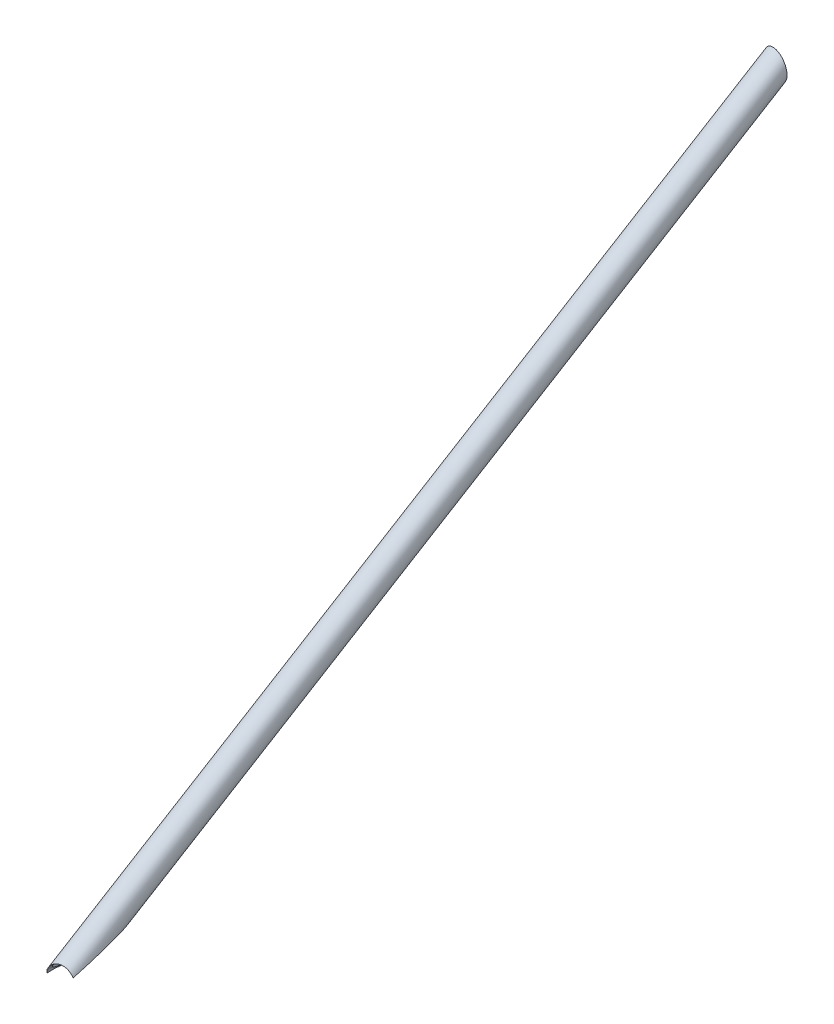
ISO-10303-21;
HEADER;
FILE_DESCRIPTION(('STEP AP214'),'2;1');
FILE_NAME('part.step','',(''),(''),'','','');
FILE_SCHEMA(('AUTOMOTIVE_DESIGN { 1 0 10303 214 1 1 1 1 }'));
ENDSEC;
DATA;
#1=APPLICATION_CONTEXT('core data for automotive mechanical design processes');
#2=APPLICATION_PROTOCOL_DEFINITION('international standard','automotive_design',2000,#1);
#3=PRODUCT_CONTEXT('',#1,'mechanical');
#4=PRODUCT('Part','Part','',(#3));
#5=PRODUCT_RELATED_PRODUCT_CATEGORY('part','',(#4));
#6=PRODUCT_DEFINITION_FORMATION('','',#4);
#7=PRODUCT_DEFINITION_CONTEXT('part definition',#1,'design');
#8=PRODUCT_DEFINITION('design','',#6,#7);
#9=PRODUCT_DEFINITION_SHAPE('','',#8);
#10=(LENGTH_UNIT() NAMED_UNIT(*) SI_UNIT(.MILLI.,.METRE.));
#11=(NAMED_UNIT(*) PLANE_ANGLE_UNIT() SI_UNIT($,.RADIAN.));
#12=(NAMED_UNIT(*) SI_UNIT($,.STERADIAN.) SOLID_ANGLE_UNIT());
#13=UNCERTAINTY_MEASURE_WITH_UNIT(LENGTH_MEASURE(1.E-05),#10,'distance_accuracy_value','');
#14=(GEOMETRIC_REPRESENTATION_CONTEXT(3) GLOBAL_UNCERTAINTY_ASSIGNED_CONTEXT((#13)) GLOBAL_UNIT_ASSIGNED_CONTEXT((#10,
#11,#12)) REPRESENTATION_CONTEXT('',''));
#15=CARTESIAN_POINT('',(0.,0.,0.));
#16=DIRECTION('',(0.,0.,1.));
#17=DIRECTION('',(1.,0.,0.));
#18=AXIS2_PLACEMENT_3D('',#15,#16,#17);
#19=CARTESIAN_POINT('',(150.,500.,-1140.));
#20=DIRECTION('',(0.0991899501072693,-0.396759800429077,0.912547540986877));
#21=DIRECTION('',(0.,-0.917070056253235,-0.39872611141445));
#22=AXIS2_PLACEMENT_3D('',#19,#20,#21);
#23=CYLINDRICAL_SURFACE('',#22,9.79999999999998);
#24=CARTESIAN_POINT('',(150.,500.,-1140.));
#25=DIRECTION('',(0.136924020573454,0.0230393226257371,-0.990313587810925));
#26=DIRECTION('',(0.508281006832032,-0.859722512143854,0.0502754433782237));
#27=AXIS2_PLACEMENT_3D('',#24,#25,#26);
#28=ELLIPSE('',#27,10.89775457985,9.79999999999998);
#29=CARTESIAN_POINT('',(155.539121670054,490.630955055884,-1139.45211055667));
#30=VERTEX_POINT('',#29);
#31=EDGE_CURVE('E112',#30,#30,#28,.T.);
#32=ORIENTED_EDGE('',*,*,#31,.T.);
#33=EDGE_LOOP('',(#32));
#34=FACE_BOUND('',#33,.T.);
#35=CARTESIAN_POINT('',(220.0037526769,210.997702741119,-499.872991264382));
#36=CARTESIAN_POINT('',(220.03556002552,211.045581506711,-499.98311153703));
#37=CARTESIAN_POINT('',(220.067778357118,211.093682206268,-500.093015871501));
#38=CARTESIAN_POINT('',(220.133089382078,211.19035188545,-500.312359740541));
#39=CARTESIAN_POINT('',(220.166182087003,211.238920871262,-500.42179926894));
#40=CARTESIAN_POINT('',(220.266856240907,211.385374312618,-500.749385929453));
#41=CARTESIAN_POINT('',(220.335827671197,211.483996112366,-500.966780081287));
#42=CARTESIAN_POINT('',(220.477978796199,211.683426048303,-501.399186360955));
#43=CARTESIAN_POINT('',(220.551158576042,211.784234228693,-501.614198440496));
#44=CARTESIAN_POINT('',(220.702352368965,211.988303520376,-502.041336513962));
#45=CARTESIAN_POINT('',(220.780366149497,212.091564513524,-502.253462646123));
#46=CARTESIAN_POINT('',(220.934139694492,212.290658259995,-502.653617320866));
#47=CARTESIAN_POINT('',(221.009375246864,212.38623132656,-502.841975705977));
#48=CARTESIAN_POINT('',(221.165198311608,212.579959508328,-503.215117058462));
#49=CARTESIAN_POINT('',(221.245785496772,212.678114465448,-503.399900243539));
#50=CARTESIAN_POINT('',(221.413414006846,212.877530128243,-503.765199044808));
#51=CARTESIAN_POINT('',(221.500463852358,212.978794827011,-503.945708597866));
#52=CARTESIAN_POINT('',(221.682215594535,213.184769626648,-504.30080106719));
#53=CARTESIAN_POINT('',(221.776915527819,213.289478839425,-504.4753854879));
#54=CARTESIAN_POINT('',(221.945291215159,213.470232716847,-504.764230267435));
#55=CARTESIAN_POINT('',(222.016512214622,213.545224200798,-504.880576145729));
#56=CARTESIAN_POINT('',(222.164287824878,213.697386615885,-505.108335477208));
#57=CARTESIAN_POINT('',(222.24084110877,213.774557001996,-505.219750146283));
#58=CARTESIAN_POINT('',(222.4000948405,213.931160247355,-505.435938617257));
#59=CARTESIAN_POINT('',(222.482780364335,214.010587341262,-505.540727461978));
#60=CARTESIAN_POINT('',(222.655621450187,214.172048836842,-505.741709486693));
#61=CARTESIAN_POINT('',(222.745770814519,214.254081041121,-505.837909663119));
#62=CARTESIAN_POINT('',(222.930782107294,214.417146030991,-506.014471692462));
#63=CARTESIAN_POINT('',(223.025249136728,214.498057535257,-506.095351621909));
#64=CARTESIAN_POINT('',(223.223682449658,214.662138601803,-506.242084398049));
#65=CARTESIAN_POINT('',(223.327644569168,214.74530716313,-506.30794378797));
#66=CARTESIAN_POINT('',(223.527799749257,214.898977217815,-506.409354582712));
#67=CARTESIAN_POINT('',(223.62245813081,214.969312188494,-506.448109299148));
#68=CARTESIAN_POINT('',(223.818141272448,215.109137224171,-506.506307129277));
#69=CARTESIAN_POINT('',(223.919155146661,215.178628503094,-506.525782356632));
#70=CARTESIAN_POINT('',(224.126458758042,215.315097256477,-506.541613229992));
#71=CARTESIAN_POINT('',(224.232794466196,215.382038459362,-506.537710974445));
#72=CARTESIAN_POINT('',(224.445436938287,215.509520494145,-506.504837326135));
#73=CARTESIAN_POINT('',(224.551743703341,215.57006162329,-506.475867098207));
#74=CARTESIAN_POINT('',(224.743375831462,215.673694654318,-506.402033121444));
#75=CARTESIAN_POINT('',(224.829338673063,215.718028860184,-506.360450288279));
#76=CARTESIAN_POINT('',(224.996803404158,215.800567145066,-506.264389449461));
#77=CARTESIAN_POINT('',(225.078303733853,215.83876908955,-506.209906969931));
#78=CARTESIAN_POINT('',(225.294354509321,215.935391475288,-506.047195204034));
#79=CARTESIAN_POINT('',(225.423856519224,215.988028537662,-505.928899451726));
#80=CARTESIAN_POINT('',(225.668682010947,216.07954436154,-505.673757286609));
#81=CARTESIAN_POINT('',(225.783952780063,216.118372918788,-505.536845634306));
#82=CARTESIAN_POINT('',(226.032998789649,216.194867481453,-505.211844603524));
#83=CARTESIAN_POINT('',(226.162983993939,216.229196654181,-505.02012298021));
#84=CARTESIAN_POINT('',(226.408157954945,216.285631614921,-504.625574342097));
#85=CARTESIAN_POINT('',(226.523317102834,216.307713225672,-504.422726223909));
#86=CARTESIAN_POINT('',(226.742562772329,216.342842705679,-504.009078695551));
#87=CARTESIAN_POINT('',(226.8465873335,216.355842045154,-503.798242822337));
#88=CARTESIAN_POINT('',(227.045179204777,216.374745353236,-503.372160485957));
#89=CARTESIAN_POINT('',(227.139755299022,216.3806559695,-503.1569183479));
#90=CARTESIAN_POINT('',(227.313744292283,216.386605818291,-502.741236593004));
#91=CARTESIAN_POINT('',(227.393764106944,216.38709249649,-502.541054767823));
#92=CARTESIAN_POINT('',(227.548392329886,216.384150350642,-502.138631973507));
#93=CARTESIAN_POINT('',(227.623000169521,216.380721115776,-501.936390790531));
#94=CARTESIAN_POINT('',(227.839961554268,216.365506941184,-501.327126979252));
#95=CARTESIAN_POINT('',(227.975375407935,216.348794110479,-500.917754216175));
#96=CARTESIAN_POINT('',(228.232286149602,216.305586474585,-500.094309912807));
#97=CARTESIAN_POINT('',(228.353752465368,216.279070698793,-499.680230157442));
#98=CARTESIAN_POINT('',(228.585261616263,216.218397475383,-498.849419653288));
#99=CARTESIAN_POINT('',(228.69530320268,216.184239193732,-498.432688619987));
#100=CARTESIAN_POINT('',(228.906064654326,216.109722643187,-497.596842482021));
#101=CARTESIAN_POINT('',(229.006771639744,216.069356006292,-497.177724905967));
#102=CARTESIAN_POINT('',(229.20013332596,215.983527216208,-496.338141494294));
#103=CARTESIAN_POINT('',(229.292787556765,215.93806476596,-495.917675581462));
#104=CARTESIAN_POINT('',(229.470991088976,215.84291840624,-495.076332225744));
#105=CARTESIAN_POINT('',(229.556549928964,215.793240352003,-494.655456130975));
#106=CARTESIAN_POINT('',(229.721520147706,215.690226524152,-493.812946550329));
#107=CARTESIAN_POINT('',(229.800931412859,215.636890682979,-493.391313050601));
#108=CARTESIAN_POINT('',(230.029148015592,215.473447233457,-492.135414322682));
#109=CARTESIAN_POINT('',(230.169988123022,215.358763686548,-491.300291355377));
#110=CARTESIAN_POINT('',(230.433859337584,215.119982671909,-489.628564397814));
#111=CARTESIAN_POINT('',(230.556889156698,214.995884524313,-488.791960304867));
#112=CARTESIAN_POINT('',(230.787533282199,214.740261756117,-487.117170346715));
#113=CARTESIAN_POINT('',(230.895136854892,214.608732052449,-486.278983787348));
#114=CARTESIAN_POINT('',(231.096380401341,214.339997521533,-484.601880626632));
#115=CARTESIAN_POINT('',(231.190020765879,214.202792853246,-483.762964046377));
#116=CARTESIAN_POINT('',(231.364121387189,213.92444994762,-482.086291425431));
#117=CARTESIAN_POINT('',(231.444609501841,213.783320785225,-481.24853675858));
#118=CARTESIAN_POINT('',(231.593128182638,213.498214932677,-479.572399069136));
#119=CARTESIAN_POINT('',(231.661158582883,213.354238204633,-478.734016038325));
#120=CARTESIAN_POINT('',(231.784747834489,213.064920706468,-477.056858361488));
#121=CARTESIAN_POINT('',(231.840310870345,212.919580411125,-476.218083941829));
#122=CARTESIAN_POINT('',(231.938473261547,212.629130112336,-474.539750933465));
#123=CARTESIAN_POINT('',(231.981072925176,212.484020103495,-473.700192363886));
#124=CARTESIAN_POINT('',(232.048772822799,212.209436208446,-472.097939090977));
#125=CARTESIAN_POINT('',(232.075129038066,212.079759656425,-471.335332491253));
#126=CARTESIAN_POINT('',(232.114487776357,211.824313216532,-469.809006411566));
#127=CARTESIAN_POINT('',(232.12748883077,211.698543759781,-469.045286818457));
#128=CARTESIAN_POINT('',(232.134822170626,211.514988449458,-467.898737451715));
#129=CARTESIAN_POINT('',(232.135237995237,211.454647230271,-467.516353391627));
#130=CARTESIAN_POINT('',(232.131467756979,211.336159327653,-466.75127057713));
#131=CARTESIAN_POINT('',(232.127281774119,211.278012606086,-466.368571828308));
#132=CARTESIAN_POINT('',(232.113631523341,211.164500699147,-465.602910496098));
#133=CARTESIAN_POINT('',(232.104168062251,211.109135090007,-465.219947961974));
#134=CARTESIAN_POINT('',(232.079058013934,211.00190464163,-464.453743304106));
#135=CARTESIAN_POINT('',(232.063411643728,210.950039679596,-464.070501190645));
#136=CARTESIAN_POINT('',(232.022374385927,210.844639670458,-463.256917164985));
#137=CARTESIAN_POINT('',(231.996025811164,210.791676056746,-462.826546895493));
#138=CARTESIAN_POINT('',(231.931687867375,210.692939767071,-461.965757965668));
#139=CARTESIAN_POINT('',(231.89369667788,210.647168217372,-461.535339308297));
#140=CARTESIAN_POINT('',(231.802733822247,210.564975943137,-460.674955057049));
#141=CARTESIAN_POINT('',(231.74975743448,210.52855817276,-460.244989648912));
#142=CARTESIAN_POINT('',(231.655424725332,210.483103335801,-459.601623808325));
#143=CARTESIAN_POINT('',(231.621506691049,210.469481283049,-459.387454034367));
#144=CARTESIAN_POINT('',(231.547896597998,210.445721754516,-458.959922021155));
#145=CARTESIAN_POINT('',(231.508204957544,210.435584026465,-458.746559724545));
#146=CARTESIAN_POINT('',(231.410059633138,210.416962862096,-458.26143107358));
#147=CARTESIAN_POINT('',(231.349464435341,210.409737496682,-457.990039781463));
#148=CARTESIAN_POINT('',(231.21490000988,210.402772913525,-457.450410347947));
#149=CARTESIAN_POINT('',(231.140929490743,210.403034419069,-457.182172513701));
#150=CARTESIAN_POINT('',(230.976976152554,210.412016856456,-456.651379210244));
#151=CARTESIAN_POINT('',(230.887030602703,210.420718304568,-456.388812077079));
#152=CARTESIAN_POINT('',(230.687912451467,210.447257520454,-455.871522364126));
#153=CARTESIAN_POINT('',(230.578747823276,210.465091505353,-455.616796582573));
#154=CARTESIAN_POINT('',(230.368698616877,210.504213203939,-455.181954283669));
#155=CARTESIAN_POINT('',(230.272723862386,210.523481030966,-454.99928621621));
#156=CARTESIAN_POINT('',(230.067397167309,210.566701719194,-454.642118096433));
#157=CARTESIAN_POINT('',(229.958043252596,210.590655272098,-454.467619254767));
#158=CARTESIAN_POINT('',(229.725545542551,210.642382952414,-454.12887002045));
#159=CARTESIAN_POINT('',(229.602414523656,210.670153545399,-453.964610348916));
#160=CARTESIAN_POINT('',(229.342386984366,210.728219889474,-453.64794839698));
#161=CARTESIAN_POINT('',(229.205496140185,210.758514598437,-453.495541272805));
#162=CARTESIAN_POINT('',(228.918221385149,210.820044905617,-453.203464430254));
#163=CARTESIAN_POINT('',(228.767804655659,210.85128266311,-453.063827446327));
#164=CARTESIAN_POINT('',(228.454965582529,210.912738832329,-452.7984791077));
#165=CARTESIAN_POINT('',(228.292542720518,210.94295719996,-452.672768354859));
#166=CARTESIAN_POINT('',(227.957009804585,211.0005123595,-452.435301558305));
#167=CARTESIAN_POINT('',(227.783885786752,211.027845254699,-452.323564348643));
#168=CARTESIAN_POINT('',(227.428821436161,211.077825359224,-452.113937203271));
#169=CARTESIAN_POINT('',(227.246880843222,211.100472430165,-452.016047676549));
#170=CARTESIAN_POINT('',(226.877984681004,211.1393364132,-451.83454429445));
#171=CARTESIAN_POINT('',(226.691110377795,211.155623976197,-451.750779827046));
#172=CARTESIAN_POINT('',(226.311913140475,211.180923774732,-451.595421256622));
#173=CARTESIAN_POINT('',(226.119590352967,211.189936205833,-451.523826826502));
#174=CARTESIAN_POINT('',(225.730902981163,211.1997219212,-451.392000587492));
#175=CARTESIAN_POINT('',(225.534538544611,211.200495506109,-451.331768364066));
#176=CARTESIAN_POINT('',(225.13903222672,211.193062249648,-451.221874987947));
#177=CARTESIAN_POINT('',(224.939890026075,211.184854367311,-451.1722150614));
#178=CARTESIAN_POINT('',(224.504208270185,211.156572783706,-451.074736718853));
#179=CARTESIAN_POINT('',(224.267356389057,211.134637803814,-451.028839715108));
#180=CARTESIAN_POINT('',(223.793228285301,211.076876379378,-450.949700899056));
#181=CARTESIAN_POINT('',(223.555952025395,211.041048648107,-450.916460259531));
#182=CARTESIAN_POINT('',(223.082514044941,210.955118478283,-450.861740074036));
#183=CARTESIAN_POINT('',(222.846352912753,210.905009209785,-450.840266169737));
#184=CARTESIAN_POINT('',(222.376799693227,210.790378999721,-450.808366902896));
#185=CARTESIAN_POINT('',(222.143407698085,210.725857579722,-450.797941907207));
#186=CARTESIAN_POINT('',(221.65805180188,210.575377871167,-450.787023464097));
#187=CARTESIAN_POINT('',(221.40652225065,210.48793429129,-450.787609094262));
#188=CARTESIAN_POINT('',(220.910366166003,210.295995260832,-450.800743483162));
#189=CARTESIAN_POINT('',(220.665740098402,210.191498662804,-450.813293047189));
#190=CARTESIAN_POINT('',(220.18508361354,209.965959023436,-450.849869392075));
#191=CARTESIAN_POINT('',(219.949054382471,209.844913709576,-450.873897750368));
#192=CARTESIAN_POINT('',(219.487251361814,209.587017712996,-450.933077915949));
#193=CARTESIAN_POINT('',(219.261477551474,209.450167062263,-450.968229700726));
#194=CARTESIAN_POINT('',(218.816338965461,209.158066365179,-451.050423044231));
#195=CARTESIAN_POINT('',(218.597264626679,209.002449091401,-451.097733575078));
#196=CARTESIAN_POINT('',(218.17299251229,208.676813301081,-451.203693075977));
#197=CARTESIAN_POINT('',(217.967795099024,208.506794408758,-451.262342341941));
#198=CARTESIAN_POINT('',(217.57263621266,208.15375451181,-451.39104862957));
#199=CARTESIAN_POINT('',(217.382678482238,207.970730333934,-451.4611084408));
#200=CARTESIAN_POINT('',(217.019333011695,207.59340060422,-451.612849546105));
#201=CARTESIAN_POINT('',(216.845944984704,207.399095247785,-451.694530638922));
#202=CARTESIAN_POINT('',(216.517127010207,207.001463426555,-451.869797325056));
#203=CARTESIAN_POINT('',(216.361669145948,206.798151686802,-451.963363922236));
#204=CARTESIAN_POINT('',(216.069353030802,206.384458633962,-452.163150925278));
#205=CARTESIAN_POINT('',(215.932495913643,206.174076890928,-452.269372101704));
#206=CARTESIAN_POINT('',(215.678221609351,205.74897311671,-452.495305197383));
#207=CARTESIAN_POINT('',(215.560797049619,205.534252766422,-452.615011971174));
#208=CARTESIAN_POINT('',(215.345888548902,205.103516898915,-452.869072079184));
#209=CARTESIAN_POINT('',(215.248400293771,204.887501672341,-453.00342223496));
#210=CARTESIAN_POINT('',(215.090890621672,204.500412096529,-453.259901447249));
#211=CARTESIAN_POINT('',(215.027272668419,204.328906974948,-453.379184368226));
#212=CARTESIAN_POINT('',(214.912913340089,203.989638389092,-453.628743474979));
#213=CARTESIAN_POINT('',(214.862170266401,203.821874433904,-453.759018207557));
#214=CARTESIAN_POINT('',(214.773311251004,203.492774995035,-454.031016686563));
#215=CARTESIAN_POINT('',(214.735177699656,203.331430825464,-454.172724119594));
#216=CARTESIAN_POINT('',(214.670838441952,203.017579461572,-454.468164140243));
#217=CARTESIAN_POINT('',(214.644632711819,202.865072249635,-454.621896703889));
#218=CARTESIAN_POINT('',(214.603066061234,202.570604579879,-454.942471335902));
#219=CARTESIAN_POINT('',(214.587778618253,202.428721227632,-455.10939398228));
#220=CARTESIAN_POINT('',(214.567006406174,202.159128267461,-455.454880189148));
#221=CARTESIAN_POINT('',(214.561520903747,202.031417599885,-455.633442877757));
#222=CARTESIAN_POINT('',(214.558726260017,201.792082847687,-456.000963599059));
#223=CARTESIAN_POINT('',(214.561412930517,201.680450553697,-456.189916258206));
#224=CARTESIAN_POINT('',(214.573192065187,201.47414046516,-456.576658516784));
#225=CARTESIAN_POINT('',(214.582285322902,201.379464772746,-456.774449208084));
#226=CARTESIAN_POINT('',(214.607278186622,201.191144694196,-457.214168423304));
#227=CARTESIAN_POINT('',(214.624124428264,201.100917551685,-457.457504175851));
#228=CARTESIAN_POINT('',(214.661965490966,200.942745834265,-457.950964251487));
#229=CARTESIAN_POINT('',(214.682961612019,200.874808259575,-458.201090680592));
#230=CARTESIAN_POINT('',(214.727343631655,200.758561143974,-458.706421705087));
#231=CARTESIAN_POINT('',(214.750736939813,200.710314906425,-458.961639954274));
#232=CARTESIAN_POINT('',(214.798608170743,200.630964957437,-459.474516530104));
#233=CARTESIAN_POINT('',(214.823085953751,200.599859043913,-459.732174538974));
#234=CARTESIAN_POINT('',(214.882939148638,200.541779294508,-460.35994339471));
#235=CARTESIAN_POINT('',(214.918470539493,200.522346075851,-460.73072436466));
#236=CARTESIAN_POINT('',(214.988979598822,200.506271823783,-461.47290915486));
#237=CARTESIAN_POINT('',(215.023956900294,200.509645311717,-461.844313221381));
#238=CARTESIAN_POINT('',(215.093033062411,200.534106985856,-462.587414891319));
#239=CARTESIAN_POINT('',(215.127129742027,200.555235481946,-462.959111238201));
#240=CARTESIAN_POINT('',(215.194318703498,200.611399204075,-463.701415006376));
#241=CARTESIAN_POINT('',(215.227411206734,200.646431340567,-464.072022651172));
#242=CARTESIAN_POINT('',(215.293013269162,200.727899527088,-464.815251961846));
#243=CARTESIAN_POINT('',(215.325515396544,200.774430787414,-465.187863647876));
#244=CARTESIAN_POINT('',(215.389844255407,200.87656829924,-465.931899971359));
#245=CARTESIAN_POINT('',(215.421670958298,200.932174934028,-466.303324558));
#246=CARTESIAN_POINT('',(215.48481743373,201.050738775214,-467.044443355389));
#247=CARTESIAN_POINT('',(215.516137910028,201.113684556248,-467.414139347984));
#248=CARTESIAN_POINT('',(215.578531460335,201.245767947008,-468.152428170174));
#249=CARTESIAN_POINT('',(215.609604540106,201.314905412085,-468.521021025334));
#250=CARTESIAN_POINT('',(215.697247140183,201.517422333069,-469.559996662244));
#251=CARTESIAN_POINT('',(215.753762722179,201.65686189066,-470.229203160508));
#252=CARTESIAN_POINT('',(215.86769069973,201.948994806294,-471.564656359521));
#253=CARTESIAN_POINT('',(215.92510315786,202.101689092557,-472.230902849541));
#254=CARTESIAN_POINT('',(216.041714327821,202.417758169465,-473.560870278523));
#255=CARTESIAN_POINT('',(216.100913482433,202.58113561953,-474.224590544769));
#256=CARTESIAN_POINT('',(216.221843751786,202.916770823289,-475.549551882029));
#257=CARTESIAN_POINT('',(216.283574895249,203.089028677725,-476.210792924826));
#258=CARTESIAN_POINT('',(216.410400729591,203.441649956388,-477.532487840248));
#259=CARTESIAN_POINT('',(216.475503090714,203.62203173095,-478.192936075054));
#260=CARTESIAN_POINT('',(216.609582658873,203.989707201696,-479.511514639894));
#261=CARTESIAN_POINT('',(216.678559890603,204.177000941928,-480.169644955127));
#262=CARTESIAN_POINT('',(216.821013803269,204.557928198977,-481.483416589769));
#263=CARTESIAN_POINT('',(216.894489461128,204.751560269639,-482.139058439372));
#264=CARTESIAN_POINT('',(217.046621618757,205.144892172153,-483.447915261066));
#265=CARTESIAN_POINT('',(217.125278100046,205.34459198236,-484.101130241805));
#266=CARTESIAN_POINT('',(217.287770659712,205.7481134836,-485.399146919923));
#267=CARTESIAN_POINT('',(217.371554119183,205.951882332987,-486.043971611461));
#268=CARTESIAN_POINT('',(217.545732154359,206.365274200028,-487.330854308898));
#269=CARTESIAN_POINT('',(217.636126775996,206.574897258349,-487.972912295543));
#270=CARTESIAN_POINT('',(217.8245187696,207.000264103688,-489.254200815399));
#271=CARTESIAN_POINT('',(217.922519445984,207.216010524864,-489.893429990724));
#272=CARTESIAN_POINT('',(218.12725159035,207.653873075863,-491.168292383483));
#273=CARTESIAN_POINT('',(218.233982889653,207.875989082569,-491.803925670137));
#274=CARTESIAN_POINT('',(218.457341711957,208.326509101169,-493.069186482446));
#275=CARTESIAN_POINT('',(218.573940966813,208.554893964726,-493.698825775585));
#276=CARTESIAN_POINT('',(218.819211486035,209.019323980088,-494.952890239999));
#277=CARTESIAN_POINT('',(218.947882246118,209.255368811632,-495.577315627897));
#278=CARTESIAN_POINT('',(219.219830997629,209.73612539211,-496.819166860318));
#279=CARTESIAN_POINT('',(219.363098972153,209.980831123501,-497.436597185985));
#280=CARTESIAN_POINT('',(219.591889867724,210.355777760452,-498.355996326641));
#281=CARTESIAN_POINT('',(219.67046158271,210.482064382989,-498.661314519848));
#282=CARTESIAN_POINT('',(219.832916103238,210.7375821389,-499.269290082107));
#283=CARTESIAN_POINT('',(219.916798647859,210.866813127419,-499.571947581048));
#284=CARTESIAN_POINT('',(220.0037526769,210.997702741119,-499.872991264382));
#285=B_SPLINE_CURVE_WITH_KNOTS('',3,(#35,#36,#37,#38,#39,#40,#41,#42,#43,#44,#45,#46,#47,#48,
#49,#50,#51,#52,#53,#54,#55,#56,#57,#58,#59,#60,#61,#62,#63,#64,#65,#66,#67,#68,#69,#70,#71,#72,
#73,#74,#75,#76,#77,#78,#79,#80,#81,#82,#83,#84,#85,#86,#87,#88,#89,#90,#91,#92,#93,#94,#95,#96,
#97,#98,#99,#100,#101,#102,#103,#104,#105,#106,#107,#108,#109,#110,#111,#112,#113,#114,#115,
#116,#117,#118,#119,#120,#121,#122,#123,#124,#125,#126,#127,#128,#129,#130,#131,#132,#133,#134,
#135,#136,#137,#138,#139,#140,#141,#142,#143,#144,#145,#146,#147,#148,#149,#150,#151,#152,#153,
#154,#155,#156,#157,#158,#159,#160,#161,#162,#163,#164,#165,#166,#167,#168,#169,#170,#171,#172,
#173,#174,#175,#176,#177,#178,#179,#180,#181,#182,#183,#184,#185,#186,#187,#188,#189,#190,#191,
#192,#193,#194,#195,#196,#197,#198,#199,#200,#201,#202,#203,#204,#205,#206,#207,#208,#209,#210,
#211,#212,#213,#214,#215,#216,#217,#218,#219,#220,#221,#222,#223,#224,#225,#226,#227,#228,#229,
#230,#231,#232,#233,#234,#235,#236,#237,#238,#239,#240,#241,#242,#243,#244,#245,#246,#247,#248,
#249,#250,#251,#252,#253,#254,#255,#256,#257,#258,#259,#260,#261,#262,#263,#264,#265,#266,#267,
#268,#269,#270,#271,#272,#273,#274,#275,#276,#277,#278,#279,#280,#281,#282,#283,#284),
.UNSPECIFIED.,.T.,.F.,(4,2,2,2,2,2,2,2,2,2,2,2,2,2,2,2,2,2,2,2,2,2,2,2,2,2,2,2,2,2,2,2,2,2,2,2,
2,2,2,2,2,2,2,2,2,2,2,2,2,2,2,2,2,2,2,2,2,2,2,2,2,2,2,2,2,2,2,2,2,2,2,2,2,2,2,2,2,2,2,2,2,2,2,2,
2,2,2,2,2,2,2,2,2,2,2,2,2,2,2,2,2,2,2,2,2,2,2,2,2,2,2,2,2,2,2,2,2,2,2,2,2,2,2,2,4),(0.,
0.372656770587724,0.745318471844485,1.49071308268037,2.23612277740791,2.98149664065475,
3.65406094616525,4.32658416780523,5.00001037709808,5.67326429844799,6.14012333885416,
6.60686661692455,7.07250907460701,7.53776868574708,7.98208141688536,8.42620022577558,
8.79727076074999,9.16772216178766,9.54226787200702,9.91679617914032,10.2314548196973,
10.5462227509919,11.0924005303048,11.6405442480981,12.3413804236135,13.0435952029321,
13.7495340451263,14.4548103535961,15.1014276928732,15.7481128752654,17.0420983316937,
18.3388680707734,19.635779396623,20.934454351504,22.233205051697,23.5301804953071,
24.8271799002082,27.3907862639257,29.9545779320781,32.5201449360634,35.0856401251403,
37.6456288357005,40.205651635382,42.7648139098149,45.3239153198481,47.6458265647582,
49.9679931131774,51.1293146701851,52.2906160362071,53.4517399097151,54.6128230314761,
55.9158987685947,57.2191783619642,58.5228690590363,59.1745812907695,59.8262463275146,
60.6603839156199,61.4946020880321,62.3268990279022,63.1588514926516,63.7800162550909,
64.4012727826592,65.0219578790863,65.6423879727893,66.2643663099992,66.8863715171704,
67.5092062511456,68.1320593765177,68.7477813950486,69.3634868618619,69.9791698611069,
70.5949242266922,71.3209183365126,72.0469797030348,72.7733888825721,73.4998221799774,
74.2977894077413,75.0958103504572,75.8939409900742,76.6920700144812,77.5096568835787,
78.3272650924683,79.1450734849104,79.9628677161376,80.7793709675808,81.5959239631073,
82.4121664494201,83.2282321163839,83.8827396896561,84.5371608673725,85.1906642246678,
85.8441662792423,86.5020258338586,87.1598361689056,87.8173094363615,88.4748641553017,
89.2538141784688,90.0330086036064,90.8146886044151,91.5962681563083,92.7142390967945,
93.8329219317383,94.9541514390703,96.0751319357715,97.2057245988692,98.3363650236135,
99.4652682293601,100.594145068715,102.651682945834,104.709365027261,106.767561303538,
108.825780933951,110.888908964135,112.952050144164,115.014723834427,117.077390167357,
119.121607870329,121.165839777025,123.210964816946,125.256050353934,127.295463854278,
129.334792196911,131.372730417662,132.391538960581,133.410297488323),.UNSPECIFIED.);
#286=CARTESIAN_POINT('',(215.417930816631,200.926928641913,-466.260367661848));
#287=VERTEX_POINT('',#286);
#288=CARTESIAN_POINT('',(227.660575393344,211.04511124453,-452.251060542699));
#289=VERTEX_POINT('',#288);
#290=EDGE_CURVE('E114',#287,#289,#285,.T.);
#291=ORIENTED_EDGE('',*,*,#290,.T.);
#292=CARTESIAN_POINT('',(222.839154654503,199.656094830706,-473.787293070432));
#293=CARTESIAN_POINT('',(223.018126877463,199.643591059707,-473.758535960361));
#294=CARTESIAN_POINT('',(223.195574144502,199.631988397977,-473.720070631462));
#295=CARTESIAN_POINT('',(223.545962963295,199.610563433115,-473.625840161621));
#296=CARTESIAN_POINT('',(223.718901219133,199.600742402683,-473.570062730354));
#297=CARTESIAN_POINT('',(224.230485185833,199.573798926252,-473.379723840667));
#298=CARTESIAN_POINT('',(224.560890637959,199.559265174873,-473.222340151423));
#299=CARTESIAN_POINT('',(225.115207150444,199.539218153319,-472.909283521848));
#300=CARTESIAN_POINT('',(225.344842434828,199.532351103039,-472.763341178782));
#301=CARTESIAN_POINT('',(225.790770047889,199.521632874282,-472.451963802108));
#302=CARTESIAN_POINT('',(226.007054070695,199.517783556072,-472.286516817125));
#303=CARTESIAN_POINT('',(226.426972466851,199.51281750651,-471.940149775685));
#304=CARTESIAN_POINT('',(226.630598704961,199.511702515186,-471.759219942233));
#305=CARTESIAN_POINT('',(227.02615371479,199.511980522969,-471.384918854753));
#306=CARTESIAN_POINT('',(227.218078060016,199.513374465123,-471.191542948894));
#307=CARTESIAN_POINT('',(227.587069014274,199.518453233163,-470.799016805833));
#308=CARTESIAN_POINT('',(227.764367576869,199.522087720744,-470.60008274809));
#309=CARTESIAN_POINT('',(228.109441288441,199.531502625706,-470.194244537608));
#310=CARTESIAN_POINT('',(228.277217713129,199.537282754845,-469.987341458768));
#311=CARTESIAN_POINT('',(228.60418007857,199.550943495147,-469.566632725166));
#312=CARTESIAN_POINT('',(228.763357875858,199.55882605692,-469.352820823221));
#313=CARTESIAN_POINT('',(229.073624819638,199.576685129402,-468.919478206141));
#314=CARTESIAN_POINT('',(229.224713007535,199.586661887581,-468.699946817827));
#315=CARTESIAN_POINT('',(229.667869181,199.619862474815,-468.032317137513));
#316=CARTESIAN_POINT('',(229.948584698145,199.646304641042,-467.576809194585));
#317=CARTESIAN_POINT('',(230.483327907712,199.708538666675,-466.651478692578));
#318=CARTESIAN_POINT('',(230.737370084064,199.744325414664,-466.181664082863));
#319=CARTESIAN_POINT('',(231.118309552308,199.809376057086,-465.433769805587));
#320=CARTESIAN_POINT('',(231.253211517125,199.834909102555,-465.159403004765));
#321=CARTESIAN_POINT('',(231.51555973567,199.890155863552,-464.607526745082));
#322=CARTESIAN_POINT('',(231.643005778174,199.91986969744,-464.330017197452));
#323=CARTESIAN_POINT('',(231.890853715194,199.984193937459,-463.772072521653));
#324=CARTESIAN_POINT('',(232.011247899665,200.018809566665,-463.491634572269));
#325=CARTESIAN_POINT('',(232.245020122398,200.093844093069,-462.928627316419));
#326=CARTESIAN_POINT('',(232.358398463755,200.134262739317,-462.64605810262));
#327=CARTESIAN_POINT('',(232.577670117854,200.221957649125,-462.080673713729));
#328=CARTESIAN_POINT('',(232.683596857967,200.269199938559,-461.797866281307));
#329=CARTESIAN_POINT('',(232.888469011503,200.372403617432,-461.231230530389));
#330=CARTESIAN_POINT('',(232.987413135081,200.428366611686,-460.947402033404));
#331=CARTESIAN_POINT('',(233.177762424725,200.5512570305,-460.380146226548));
#332=CARTESIAN_POINT('',(233.269180699591,200.61816475648,-460.096719102097));
#333=CARTESIAN_POINT('',(233.443889300706,200.766237481178,-459.531141272493));
#334=CARTESIAN_POINT('',(233.527183674459,200.847395323155,-459.248989999199));
#335=CARTESIAN_POINT('',(233.655738537279,200.995634863695,-458.789778698669));
#336=CARTESIAN_POINT('',(233.703836326704,201.057145345973,-458.611719917736));
#337=CARTESIAN_POINT('',(233.795557289162,201.18928596225,-458.257776731554));
#338=CARTESIAN_POINT('',(233.839179882877,201.259917274283,-458.081892610401));
#339=CARTESIAN_POINT('',(233.921019609069,201.411789800663,-457.733881692268));
#340=CARTESIAN_POINT('',(233.959247672216,201.49300889948,-457.561747912879));
#341=CARTESIAN_POINT('',(234.029259122289,201.667893834661,-457.222539903577));
#342=CARTESIAN_POINT('',(234.061044524807,201.761555763047,-457.055464105228));
#343=CARTESIAN_POINT('',(234.110483411894,201.940282584439,-456.765130170365));
#344=CARTESIAN_POINT('',(234.129707591027,202.022576583294,-456.640437328826));
#345=CARTESIAN_POINT('',(234.16261445012,202.1959751337,-456.396585222185));
#346=CARTESIAN_POINT('',(234.176298906788,202.287076848794,-456.277424193782));
#347=CARTESIAN_POINT('',(234.197323847144,202.478017983958,-456.045954717706));
#348=CARTESIAN_POINT('',(234.204672421802,202.577846080309,-455.933637701119));
#349=CARTESIAN_POINT('',(234.212341146127,202.785857995012,-455.716753698197));
#350=CARTESIAN_POINT('',(234.212661354417,202.894041743663,-455.612186647229));
#351=CARTESIAN_POINT('',(234.205734053109,203.117943723927,-455.411383772116));
#352=CARTESIAN_POINT('',(234.198475278768,203.233672930432,-455.315160580096));
#353=CARTESIAN_POINT('',(234.176077705357,203.471157023263,-455.131487465486));
#354=CARTESIAN_POINT('',(234.160938692567,203.592912072936,-455.044037780919));
#355=CARTESIAN_POINT('',(234.122687663839,203.841149084941,-454.877554226545));
#356=CARTESIAN_POINT('',(234.099560977121,203.967639360519,-454.798536194978));
#357=CARTESIAN_POINT('',(234.045465164819,204.223668258608,-454.648500725256));
#358=CARTESIAN_POINT('',(234.014493504328,204.353207854134,-454.57748588387));
#359=CARTESIAN_POINT('',(233.930234402799,204.669120082522,-454.414155990844));
#360=CARTESIAN_POINT('',(233.873048318181,204.856365527024,-454.325529605526));
#361=CARTESIAN_POINT('',(233.744124231348,205.231140921948,-454.160289565096));
#362=CARTESIAN_POINT('',(233.672379829426,205.418670961366,-454.083681219359));
#363=CARTESIAN_POINT('',(233.515047529608,205.792003746724,-453.939911921116));
#364=CARTESIAN_POINT('',(233.429431543518,205.977802161676,-453.872770665301));
#365=CARTESIAN_POINT('',(233.245250371276,206.345465672803,-453.74604988641));
#366=CARTESIAN_POINT('',(233.146685512897,206.527330868403,-453.686470172005));
#367=CARTESIAN_POINT('',(232.90545645185,206.940197302742,-453.555945839924));
#368=CARTESIAN_POINT('',(232.758491451259,207.169342501315,-453.487046803037));
#369=CARTESIAN_POINT('',(232.445025040548,207.616033377099,-453.356338042995));
#370=CARTESIAN_POINT('',(232.278518853608,207.83357619914,-453.294530060571));
#371=CARTESIAN_POINT('',(231.92730211165,208.254782816047,-453.175998571871));
#372=CARTESIAN_POINT('',(231.742598088849,208.458451547014,-453.119273255002));
#373=CARTESIAN_POINT('',(231.356208295239,208.850015219163,-453.009434325908));
#374=CARTESIAN_POINT('',(231.154523919544,209.037911453691,-452.956320417615));
#375=CARTESIAN_POINT('',(230.734741895244,209.396770571358,-452.8524990724));
#376=CARTESIAN_POINT('',(230.51658866715,209.567671151,-452.80180082072));
#377=CARTESIAN_POINT('',(230.065960624096,209.890073015936,-452.702317941309));
#378=CARTESIAN_POINT('',(229.833485520318,210.041573909821,-452.653533352202));
#379=CARTESIAN_POINT('',(229.355900027362,210.323567488681,-452.557455634917));
#380=CARTESIAN_POINT('',(229.110792741885,210.454065301887,-452.510162144939));
#381=CARTESIAN_POINT('',(228.609691509294,210.69269459076,-452.416826482081));
#382=CARTESIAN_POINT('',(228.353697962913,210.800826888864,-452.370784263243));
#383=CARTESIAN_POINT('',(227.840547784166,210.99067083235,-452.281245207007));
#384=CARTESIAN_POINT('',(227.583652796593,211.073073364223,-452.237713400386));
#385=CARTESIAN_POINT('',(227.063387964462,211.214855363321,-452.15184405584));
#386=CARTESIAN_POINT('',(226.800018223387,211.274235198258,-452.109506498851));
#387=CARTESIAN_POINT('',(226.268869479548,211.369363930223,-452.026212531128));
#388=CARTESIAN_POINT('',(226.001091122422,211.405116256484,-451.985255920785));
#389=CARTESIAN_POINT('',(225.463174931419,211.452680272123,-451.904993345042));
#390=CARTESIAN_POINT('',(225.193037156993,211.464492562991,-451.865687338194));
#391=CARTESIAN_POINT('',(224.66340761345,211.464153406513,-451.790633376924));
#392=CARTESIAN_POINT('',(224.403925908461,211.452949278325,-451.754805856565));
#393=CARTESIAN_POINT('',(223.886541492589,211.408685394261,-451.685393675803));
#394=CARTESIAN_POINT('',(223.628638731348,211.375626339126,-451.651808943527));
#395=CARTESIAN_POINT('',(223.116194960702,211.288106604102,-451.587344725663));
#396=CARTESIAN_POINT('',(222.861653456193,211.233649113318,-451.556464837797));
#397=CARTESIAN_POINT('',(222.357534558254,211.103987553147,-451.497937459747));
#398=CARTESIAN_POINT('',(222.107957257472,211.028783096941,-451.470290029846));
#399=CARTESIAN_POINT('',(221.612247644631,210.857413782035,-451.418531892345));
#400=CARTESIAN_POINT('',(221.366195884217,210.761001652271,-451.394469053719));
#401=CARTESIAN_POINT('',(220.882168454306,210.548806161363,-451.351054216731));
#402=CARTESIAN_POINT('',(220.644192894936,210.433022536198,-451.331702282585));
#403=CARTESIAN_POINT('',(220.177382155357,210.183143509045,-451.298609518153));
#404=CARTESIAN_POINT('',(219.948555374607,210.049031757407,-451.284873741947));
#405=CARTESIAN_POINT('',(219.501394438924,209.763877966419,-451.264167351674));
#406=CARTESIAN_POINT('',(219.283060273689,209.612835943695,-451.257196730965));
#407=CARTESIAN_POINT('',(218.846588389026,209.286821903624,-451.25128622783));
#408=CARTESIAN_POINT('',(218.629074170982,209.111005945189,-451.252791475754));
#409=CARTESIAN_POINT('',(218.207722788287,208.74398651147,-451.267026019214));
#410=CARTESIAN_POINT('',(218.00388892436,208.552779346977,-451.27975801308));
#411=CARTESIAN_POINT('',(217.611044393745,208.157363659327,-451.319290271555));
#412=CARTESIAN_POINT('',(217.422020920852,207.95316665135,-451.3460782245));
#413=CARTESIAN_POINT('',(217.05956466292,207.534381125981,-451.417513476618));
#414=CARTESIAN_POINT('',(216.886122510173,207.319798973331,-451.462149955804));
#415=CARTESIAN_POINT('',(216.62082098372,206.969776977264,-451.55218515795));
#416=CARTESIAN_POINT('',(216.523718006024,206.836425996117,-451.590370334324));
#417=CARTESIAN_POINT('',(216.335863455951,206.568414945615,-451.676455170396));
#418=CARTESIAN_POINT('',(216.245109778183,206.433755327228,-451.724351589169));
#419=CARTESIAN_POINT('',(216.070420843352,206.164787262577,-451.831122551879));
#420=CARTESIAN_POINT('',(215.986471247666,206.030478687282,-451.889973099977));
#421=CARTESIAN_POINT('',(215.825500625736,205.763645435248,-452.020015081117));
#422=CARTESIAN_POINT('',(215.748479599903,205.631120758615,-452.091206514893));
#423=CARTESIAN_POINT('',(215.60067809216,205.368073736897,-452.247978494931));
#424=CARTESIAN_POINT('',(215.529998414935,205.237604273688,-452.333744078931));
#425=CARTESIAN_POINT('',(215.39635793354,204.982833122849,-452.519306680667));
#426=CARTESIAN_POINT('',(215.333396043124,204.858530568723,-452.619101719561));
#427=CARTESIAN_POINT('',(215.215271511678,204.618159904509,-452.83214497604));
#428=CARTESIAN_POINT('',(215.160104202871,204.502086887102,-452.945385066651));
#429=CARTESIAN_POINT('',(215.057300204099,204.279479928072,-453.184000802169));
#430=CARTESIAN_POINT('',(215.009664650014,204.172947426325,-453.309378272953));
#431=CARTESIAN_POINT('',(214.916990194198,203.959758686628,-453.583532993179));
#432=CARTESIAN_POINT('',(214.872699628204,203.854176940757,-453.733394622034));
#433=CARTESIAN_POINT('',(214.791784736983,203.654981830277,-454.042784009653));
#434=CARTESIAN_POINT('',(214.755162290814,203.5613714014,-454.202314125341));
#435=CARTESIAN_POINT('',(214.688524967912,203.384761609345,-454.529168066647));
#436=CARTESIAN_POINT('',(214.658534329437,203.301801620404,-454.696517859265));
#437=CARTESIAN_POINT('',(214.604454977831,203.145507671176,-455.036507249884));
#438=CARTESIAN_POINT('',(214.580365860627,203.072173052005,-455.209146484807));
#439=CARTESIAN_POINT('',(214.529844528181,202.909554704426,-455.619109634295));
#440=CARTESIAN_POINT('',(214.505520485037,202.823617088398,-455.858012339926));
#441=CARTESIAN_POINT('',(214.464860386703,202.663473645598,-456.340436633143));
#442=CARTESIAN_POINT('',(214.448528599713,202.589274101731,-456.583960616734));
#443=CARTESIAN_POINT('',(214.422903312897,202.450003032995,-457.07444237781));
#444=CARTESIAN_POINT('',(214.413623350911,202.384949259894,-457.321405837824));
#445=CARTESIAN_POINT('',(214.401524920085,202.262180701464,-457.817233844054));
#446=CARTESIAN_POINT('',(214.398705258401,202.204464563157,-458.066098030801));
#447=CARTESIAN_POINT('',(214.399128538057,202.094409612152,-458.567047331348));
#448=CARTESIAN_POINT('',(214.402419350602,202.042116677171,-458.819142381804));
#449=CARTESIAN_POINT('',(214.414924299168,201.94223489121,-459.324115552838));
#450=CARTESIAN_POINT('',(214.424138613991,201.894646182277,-459.576993696824));
#451=CARTESIAN_POINT('',(214.448372142976,201.803301147658,-460.082854012757));
#452=CARTESIAN_POINT('',(214.463384560196,201.759540407957,-460.335835717709));
#453=CARTESIAN_POINT('',(214.499212308268,201.675066660033,-460.841899003615));
#454=CARTESIAN_POINT('',(214.520027795583,201.634353734024,-461.094980587079));
#455=CARTESIAN_POINT('',(214.578099053442,201.537839403418,-461.713485698568));
#456=CARTESIAN_POINT('',(214.61854947662,201.483378548678,-462.07882363879));
#457=CARTESIAN_POINT('',(214.712209537232,201.378267820027,-462.808433240232));
#458=CARTESIAN_POINT('',(214.765420001676,201.32761819341,-463.172704830789));
#459=CARTESIAN_POINT('',(214.885481451226,201.229067777202,-463.899964445433));
#460=CARTESIAN_POINT('',(214.952353257765,201.181171328271,-464.262949639406));
#461=CARTESIAN_POINT('',(215.100775887316,201.087445740848,-464.986170639032));
#462=CARTESIAN_POINT('',(215.182325828904,201.041616478427,-465.346406608424));
#463=CARTESIAN_POINT('',(215.360773390166,200.951804423747,-466.059968916063));
#464=CARTESIAN_POINT('',(215.457532692575,200.907809122704,-466.413328046574));
#465=CARTESIAN_POINT('',(215.668721646197,200.820762640683,-467.114968403933));
#466=CARTESIAN_POINT('',(215.783154877376,200.777711653003,-467.463248586333));
#467=CARTESIAN_POINT('',(216.031679866447,200.692271938321,-468.151901840331));
#468=CARTESIAN_POINT('',(216.165723800407,200.64988187022,-468.492291878068));
#469=CARTESIAN_POINT('',(216.456507346687,200.565358202717,-469.163169318311));
#470=CARTESIAN_POINT('',(216.613233073614,200.523224462721,-469.493662631093));
#471=CARTESIAN_POINT('',(216.899656370967,200.452203065729,-470.03914116641));
#472=CARTESIAN_POINT('',(217.022372000692,200.423313365514,-470.257789652138));
#473=CARTESIAN_POINT('',(217.281656678887,200.365479892919,-470.686832404627));
#474=CARTESIAN_POINT('',(217.418228580249,200.336536110614,-470.897224959142));
#475=CARTESIAN_POINT('',(217.706414703666,200.278661095521,-471.306781235246));
#476=CARTESIAN_POINT('',(217.857991687535,200.249730002162,-471.50597092184));
#477=CARTESIAN_POINT('',(218.177896053947,200.191890769544,-471.890250490919));
#478=CARTESIAN_POINT('',(218.346212718295,200.162982627391,-472.075349263274));
#479=CARTESIAN_POINT('',(218.738475443806,200.099251860402,-472.464294842785));
#480=CARTESIAN_POINT('',(218.966693956298,200.06445662055,-472.663967323638));
#481=CARTESIAN_POINT('',(219.329687320962,200.012878384928,-472.935869451415));
#482=CARTESIAN_POINT('',(219.45416649597,199.995783455054,-473.0219222833));
#483=CARTESIAN_POINT('',(219.709849007019,199.961908669364,-473.183396295253));
#484=CARTESIAN_POINT('',(219.841048887258,199.945128657564,-473.258822866));
#485=CARTESIAN_POINT('',(220.111537616672,199.911796557576,-473.398533237366));
#486=CARTESIAN_POINT('',(220.250910421592,199.89525040777,-473.462656692865));
#487=CARTESIAN_POINT('',(220.535229424151,199.862792749053,-473.577073978802));
#488=CARTESIAN_POINT('',(220.680172446312,199.846880888784,-473.627375559343));
#489=CARTESIAN_POINT('',(220.974334010904,199.815880023361,-473.713000677407));
#490=CARTESIAN_POINT('',(221.123547254248,199.800790060527,-473.748341986752));
#491=CARTESIAN_POINT('',(221.424855736501,199.771591711894,-473.80343563556));
#492=CARTESIAN_POINT('',(221.576949925318,199.75748297688,-473.82319354725));
#493=CARTESIAN_POINT('',(221.914554241781,199.727540551225,-473.849489931474));
#494=CARTESIAN_POINT('',(222.100379475686,199.7119661099,-473.852384611766));
#495=CARTESIAN_POINT('',(222.471054045471,199.682644941176,-473.836004331287));
#496=CARTESIAN_POINT('',(222.655903721047,199.668897530864,-473.816737680198));
#497=CARTESIAN_POINT('',(222.839154654503,199.656094830706,-473.787293070432));
#498=B_SPLINE_CURVE_WITH_KNOTS('',3,(#292,#293,#294,#295,#296,#297,#298,#299,#300,#301,#302,
#303,#304,#305,#306,#307,#308,#309,#310,#311,#312,#313,#314,#315,#316,#317,#318,#319,#320,#321,
#322,#323,#324,#325,#326,#327,#328,#329,#330,#331,#332,#333,#334,#335,#336,#337,#338,#339,#340,
#341,#342,#343,#344,#345,#346,#347,#348,#349,#350,#351,#352,#353,#354,#355,#356,#357,#358,#359,
#360,#361,#362,#363,#364,#365,#366,#367,#368,#369,#370,#371,#372,#373,#374,#375,#376,#377,#378,
#379,#380,#381,#382,#383,#384,#385,#386,#387,#388,#389,#390,#391,#392,#393,#394,#395,#396,#397,
#398,#399,#400,#401,#402,#403,#404,#405,#406,#407,#408,#409,#410,#411,#412,#413,#414,#415,#416,
#417,#418,#419,#420,#421,#422,#423,#424,#425,#426,#427,#428,#429,#430,#431,#432,#433,#434,#435,
#436,#437,#438,#439,#440,#441,#442,#443,#444,#445,#446,#447,#448,#449,#450,#451,#452,#453,#454,
#455,#456,#457,#458,#459,#460,#461,#462,#463,#464,#465,#466,#467,#468,#469,#470,#471,#472,#473,
#474,#475,#476,#477,#478,#479,#480,#481,#482,#483,#484,#485,#486,#487,#488,#489,#490,#491,#492,
#493,#494,#495,#496,#497),.UNSPECIFIED.,.T.,.F.,(4,2,2,2,2,2,2,2,2,2,2,2,2,2,2,2,2,2,2,2,2,2,2,
2,2,2,2,2,2,2,2,2,2,2,2,2,2,2,2,2,2,2,2,2,2,2,2,2,2,2,2,2,2,2,2,2,2,2,2,2,2,2,2,2,2,2,2,2,2,2,2,
2,2,2,2,2,2,2,2,2,2,2,2,2,2,2,2,2,2,2,2,2,2,2,2,2,2,2,2,2,2,2,4),(0.,0.5448196561764,
1.09002698250959,2.18348008937013,2.99903737115704,3.81509700479513,4.63167581507226,
5.44856162156284,6.2477315202904,7.04679409780867,7.8466006296721,8.64650172732885,
10.2524333528388,11.8574883792832,12.7777764402938,13.6980905602375,14.6193927986203,
15.5406552075602,16.4574794975454,17.3744727043589,18.2898332869061,19.2047354620583,
19.7877982334125,20.3709363878564,20.9528754495696,21.5346321691826,21.9861268499746,
22.4374766116718,22.8882491389389,23.3390179063758,23.7904576124296,24.2419095626229,
24.6941951330027,25.1466270350462,25.7903447346044,26.4343460221579,27.0796680130068,
27.7249736719861,28.566306612693,29.4078456463585,30.2490836978093,31.0902527000924,
31.9343996613062,32.7785636513606,33.6225212118612,34.4664477323918,35.2852431175344,
36.1040254245422,36.9226888695975,37.7413317455709,38.5269561078008,39.3125552815612,
40.098037418305,40.8835342010943,41.6787269541221,42.4739305459943,43.2698481886759,
44.0657650498128,44.9038583115515,45.7421530624709,46.5797147708175,47.416769507325,
47.9243967789097,48.4318549185343,48.9382142435663,49.4445735986874,49.9579217596095,
50.4711975857417,50.984164722518,51.4972091473972,52.0620770867068,52.6270832843306,
53.1941215620688,53.7611210041979,54.5256830238925,55.29065290736,56.0570876680192,
56.823380901004,57.5957028386735,58.3680480902135,59.1394906793975,59.910954070251,
61.02545383717,62.1400258570613,63.2563094568703,64.372526045961,65.479123462409,
66.5859453218822,67.690111667086,68.7936048982506,69.550350187573,70.3072516019589,
71.0623195820903,71.8169071772064,72.7292983571916,73.1857453627948,73.641959973502,
74.1042007235923,74.5661817580195,75.0276124385834,75.4888780483646,76.0469319551608,
76.6047766804963),.UNSPECIFIED.);
#499=CARTESIAN_POINT('',(217.876325625146,208.423812981198,-451.292909627262));
#500=VERTEX_POINT('',#499);
#501=EDGE_CURVE('E100',#289,#500,#498,.T.);
#502=ORIENTED_EDGE('',*,*,#501,.T.);
#503=CARTESIAN_POINT('',(214.874267929301,203.856833050254,-453.734087007117));
#504=VERTEX_POINT('',#503);
#505=EDGE_CURVE('E106',#500,#504,#285,.T.);
#506=ORIENTED_EDGE('',*,*,#505,.T.);
#507=EDGE_CURVE('E62',#504,#287,#498,.T.);
#508=ORIENTED_EDGE('',*,*,#507,.T.);
#509=EDGE_LOOP('',(#291,#502,#506,#508));
#510=FACE_BOUND('',#509,.T.);
#511=ADVANCED_FACE('F41',(#34,#510),#23,.F.);
#512=CARTESIAN_POINT('',(150.,500.,-1140.));
#513=DIRECTION('',(0.0991899501072693,-0.396759800429077,0.912547540986877));
#514=DIRECTION('',(0.,-0.917070056253235,-0.39872611141445));
#515=AXIS2_PLACEMENT_3D('',#512,#513,#514);
#516=CYLINDRICAL_SURFACE('',#515,11.);
#517=CARTESIAN_POINT('',(150.,500.,-1140.));
#518=DIRECTION('',(0.136924020573454,0.0230393226257371,-0.990313587810925));
#519=DIRECTION('',(0.508281006832032,-0.859722512143854,0.0502754433782237));
#520=AXIS2_PLACEMENT_3D('',#517,#518,#519);
#521=ELLIPSE('',#520,12.2321735079949,11.);
#522=CARTESIAN_POINT('',(156.217381466388,489.483725062727,-1139.38502205341));
#523=VERTEX_POINT('',#522);
#524=EDGE_CURVE('E102',#523,#523,#521,.T.);
#525=ORIENTED_EDGE('',*,*,#524,.F.);
#526=EDGE_LOOP('',(#525));
#527=FACE_BOUND('',#526,.T.);
#528=CARTESIAN_POINT('',(225.,200.,-450.));
#529=DIRECTION('',(-0.0862856240757923,-0.994991904096065,0.0504569307542324));
#530=DIRECTION('',(0.151358668812017,0.0369657748955679,0.987787469480062));
#531=AXIS2_PLACEMENT_3D('',#528,#529,#530);
#532=ELLIPSE('',#531,25.4477372850807,11.);
#533=CARTESIAN_POINT('',(213.984011029124,200.971685991236,-449.67698765666));
#534=VERTEX_POINT('',#533);
#535=CARTESIAN_POINT('',(216.022695663443,199.73804374393,-470.517630496749));
#536=VERTEX_POINT('',#535);
#537=EDGE_CURVE('E85',#534,#536,#532,.T.);
#538=ORIENTED_EDGE('',*,*,#537,.F.);
#539=CARTESIAN_POINT('',(225.,200.,-449.999999999999));
#540=DIRECTION('',(0.00585697944915487,-0.255026319830916,0.966916372798202));
#541=DIRECTION('',(0.526368183981438,-0.821349611595142,-0.219821178289519));
#542=AXIS2_PLACEMENT_3D('',#539,#540,#541);
#543=ELLIPSE('',#542,11.1774725151533,11.);
#544=CARTESIAN_POINT('',(215.074060086587,204.850424271084,-448.66056474583));
#545=VERTEX_POINT('',#544);
#546=EDGE_CURVE('E98',#545,#534,#543,.T.);
#547=ORIENTED_EDGE('',*,*,#546,.F.);
#548=CARTESIAN_POINT('',(225.,200.,-450.));
#549=DIRECTION('',(0.151358668812017,0.0369657748955679,0.987787469480062));
#550=DIRECTION('',(-0.0862856240757923,-0.994991904096065,0.0504569307542324));
#551=AXIS2_PLACEMENT_3D('',#548,#549,#550);
#552=ELLIPSE('',#551,12.1985062708656,11.);
#553=CARTESIAN_POINT('',(234.321437148769,206.420285631585,-451.668588843856));
#554=VERTEX_POINT('',#553);
#555=EDGE_CURVE('E109',#554,#545,#552,.T.);
#556=ORIENTED_EDGE('',*,*,#555,.F.);
#557=CARTESIAN_POINT('',(225.,200.,-449.999999999999));
#558=DIRECTION('',(0.526368183981438,-0.821349611595142,-0.219821178289519));
#559=DIRECTION('',(0.00585697944915487,-0.255026319830916,0.966916372798202));
#560=AXIS2_PLACEMENT_3D('',#557,#558,#559);
#561=ELLIPSE('',#560,61.974740767653,11.);
#562=EDGE_CURVE('E91',#536,#554,#561,.T.);
#563=ORIENTED_EDGE('',*,*,#562,.F.);
#564=EDGE_LOOP('',(#538,#547,#556,#563));
#565=FACE_BOUND('',#564,.T.);
#566=ADVANCED_FACE('F96',(#527,#565),#516,.T.);
#567=CARTESIAN_POINT('',(325.000000000001,320.,-1580.));
#568=DIRECTION('',(-0.0876619818920292,-0.105194378270435,0.99058039537993));
#569=DIRECTION('',(0.,-0.994408591727349,-0.105600912395825));
#570=AXIS2_PLACEMENT_3D('',#567,#568,#569);
#571=CYLINDRICAL_SURFACE('',#570,11.);
#572=CARTESIAN_POINT('',(225.,200.,-450.));
#573=DIRECTION('',(0.0454319322245437,0.188975755350688,0.980930223524579));
#574=DIRECTION('',(-0.410073590459099,-0.89186931574694,0.190810833122936));
#575=AXIS2_PLACEMENT_3D('',#572,#573,#574);
#576=ELLIPSE('',#575,11.6054761633343,11.);
#577=CARTESIAN_POINT('',(214.979877925743,204.520147319476,-450.406720822202));
#578=VERTEX_POINT('',#577);
#579=EDGE_CURVE('E82',#534,#578,#576,.F.);
#580=ORIENTED_EDGE('',*,*,#579,.T.);
#581=CARTESIAN_POINT('',(225.,200.,-450.));
#582=DIRECTION('',(-0.410073590459099,-0.89186931574694,0.190810833122936));
#583=DIRECTION('',(0.0454319322245437,0.188975755350688,0.980930223524579));
#584=AXIS2_PLACEMENT_3D('',#581,#582,#583);
#585=ELLIPSE('',#584,34.5064509936078,11.);
#586=EDGE_CURVE('E11',#578,#545,#585,.F.);
#587=ORIENTED_EDGE('',*,*,#586,.T.);
#588=ORIENTED_EDGE('',*,*,#546,.T.);
#589=EDGE_LOOP('',(#580,#587,#588));
#590=FACE_BOUND('',#589,.T.);
#591=ADVANCED_FACE('F43',(#590),#571,.F.);
#592=CARTESIAN_POINT('',(225.,200.,-450.));
#593=DIRECTION('',(0.0454319322245437,0.188975755350688,0.980930223524579));
#594=DIRECTION('',(-0.410073590459099,-0.89186931574694,0.190810833122936));
#595=AXIS2_PLACEMENT_3D('',#592,#593,#594);
#596=ELLIPSE('',#595,11.6054761633343,11.);
#597=EDGE_CURVE('E90',#500,#578,#596,.T.);
#598=ORIENTED_EDGE('',*,*,#597,.T.);
#599=CARTESIAN_POINT('',(225.,200.,-450.));
#600=DIRECTION('',(-0.410073590459099,-0.89186931574694,0.190810833122936));
#601=DIRECTION('',(0.0454319322245437,0.188975755350688,0.980930223524579));
#602=AXIS2_PLACEMENT_3D('',#599,#600,#601);
#603=ELLIPSE('',#602,34.5064509936078,11.);
#604=EDGE_CURVE('E50',#578,#504,#603,.T.);
#605=ORIENTED_EDGE('',*,*,#604,.T.);
#606=ORIENTED_EDGE('',*,*,#505,.F.);
#607=EDGE_LOOP('',(#598,#605,#606));
#608=FACE_BOUND('',#607,.T.);
#609=ADVANCED_FACE('F147',(#608),#571,.F.);
#610=ORIENTED_EDGE('',*,*,#290,.F.);
#611=EDGE_CURVE('E170',#287,#536,#603,.T.);
#612=ORIENTED_EDGE('',*,*,#611,.T.);
#613=ORIENTED_EDGE('',*,*,#562,.T.);
#614=EDGE_CURVE('E168',#554,#289,#596,.T.);
#615=ORIENTED_EDGE('',*,*,#614,.T.);
#616=EDGE_LOOP('',(#610,#612,#613,#615));
#617=FACE_BOUND('',#616,.T.);
#618=ADVANCED_FACE('F141',(#617),#571,.F.);
#619=CARTESIAN_POINT('',(150.,500.,-1140.));
#620=DIRECTION('',(0.136924020573454,0.0230393226257371,-0.990313587810925));
#621=DIRECTION('',(-0.990576526863067,0.,-0.13696037539341));
#622=AXIS2_PLACEMENT_3D('',#619,#620,#621);
#623=PLANE('',#622);
#624=ORIENTED_EDGE('',*,*,#31,.F.);
#625=EDGE_LOOP('',(#624));
#626=FACE_BOUND('',#625,.T.);
#627=ORIENTED_EDGE('',*,*,#524,.T.);
#628=EDGE_LOOP('',(#627));
#629=FACE_BOUND('',#628,.T.);
#630=ADVANCED_FACE('F126',(#626,#629),#623,.T.);
#631=CARTESIAN_POINT('',(225.,200.,-450.000000000001));
#632=DIRECTION('',(-0.173785333909048,-0.463427557090794,-0.868926669545238));
#633=DIRECTION('',(0.,0.882352941176471,-0.470588235294118));
#634=AXIS2_PLACEMENT_3D('',#631,#632,#633);
#635=CYLINDRICAL_SURFACE('',#634,11.);
#636=ORIENTED_EDGE('',*,*,#579,.F.);
#637=ORIENTED_EDGE('',*,*,#537,.T.);
#638=ORIENTED_EDGE('',*,*,#611,.F.);
#639=ORIENTED_EDGE('',*,*,#507,.F.);
#640=ORIENTED_EDGE('',*,*,#604,.F.);
#641=EDGE_LOOP('',(#636,#637,#638,#639,#640));
#642=FACE_BOUND('',#641,.T.);
#643=ADVANCED_FACE('F84',(#642),#635,.F.);
#644=ORIENTED_EDGE('',*,*,#597,.F.);
#645=ORIENTED_EDGE('',*,*,#501,.F.);
#646=ORIENTED_EDGE('',*,*,#614,.F.);
#647=ORIENTED_EDGE('',*,*,#555,.T.);
#648=ORIENTED_EDGE('',*,*,#586,.F.);
#649=EDGE_LOOP('',(#644,#645,#646,#647,#648));
#650=FACE_BOUND('',#649,.T.);
#651=ADVANCED_FACE('F135',(#650),#635,.F.);
#652=CLOSED_SHELL('',(#511,#566,#591,#609,#618,#630,#643,#651));
#653=MANIFOLD_SOLID_BREP('B2',#652);
#654=ADVANCED_BREP_SHAPE_REPRESENTATION('',(#18,#653),#14);
#655=SHAPE_DEFINITION_REPRESENTATION(#9,#654);
ENDSEC;
END-ISO-10303-21;
